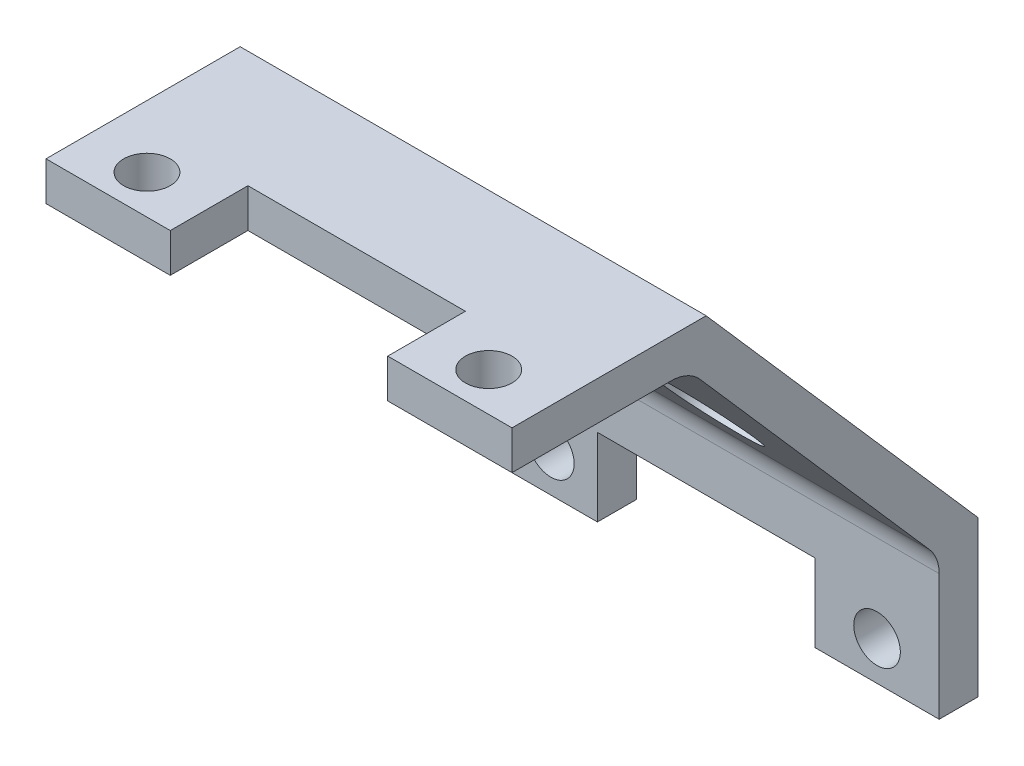
ISO-10303-21;
HEADER;
FILE_DESCRIPTION(('STEP AP214'),'2;1');
FILE_NAME('part.step','',(''),(''),'','','');
FILE_SCHEMA(('AUTOMOTIVE_DESIGN { 1 0 10303 214 1 1 1 1 }'));
ENDSEC;
DATA;
#1=APPLICATION_CONTEXT('core data for automotive mechanical design processes');
#2=APPLICATION_PROTOCOL_DEFINITION('international standard','automotive_design',2000,#1);
#3=PRODUCT_CONTEXT('',#1,'mechanical');
#4=PRODUCT('Part','Part','',(#3));
#5=PRODUCT_RELATED_PRODUCT_CATEGORY('part','',(#4));
#6=PRODUCT_DEFINITION_FORMATION('','',#4);
#7=PRODUCT_DEFINITION_CONTEXT('part definition',#1,'design');
#8=PRODUCT_DEFINITION('design','',#6,#7);
#9=PRODUCT_DEFINITION_SHAPE('','',#8);
#10=(LENGTH_UNIT() NAMED_UNIT(*) SI_UNIT(.MILLI.,.METRE.));
#11=(NAMED_UNIT(*) PLANE_ANGLE_UNIT() SI_UNIT($,.RADIAN.));
#12=(NAMED_UNIT(*) SI_UNIT($,.STERADIAN.) SOLID_ANGLE_UNIT());
#13=UNCERTAINTY_MEASURE_WITH_UNIT(LENGTH_MEASURE(1.E-05),#10,'distance_accuracy_value','');
#14=(GEOMETRIC_REPRESENTATION_CONTEXT(3) GLOBAL_UNCERTAINTY_ASSIGNED_CONTEXT((#13)) GLOBAL_UNIT_ASSIGNED_CONTEXT((#10,
#11,#12)) REPRESENTATION_CONTEXT('',''));
#15=CARTESIAN_POINT('',(0.,0.,0.));
#16=DIRECTION('',(0.,0.,1.));
#17=DIRECTION('',(1.,0.,0.));
#18=AXIS2_PLACEMENT_3D('',#15,#16,#17);
#19=CARTESIAN_POINT('',(60.,60.,55.));
#20=DIRECTION('',(0.,0.,-1.));
#21=DIRECTION('',(-1.,0.,0.));
#22=AXIS2_PLACEMENT_3D('',#19,#20,#21);
#23=PLANE('',#22);
#24=DIRECTION('',(-1.,0.,0.));
#25=VECTOR('',#24,1.);
#26=CARTESIAN_POINT('',(60.,55.,55.));
#27=LINE('',#26,#25);
#28=CARTESIAN_POINT('',(16.,55.,55.));
#29=VERTEX_POINT('',#28);
#30=CARTESIAN_POINT('',(0.,55.,55.));
#31=VERTEX_POINT('',#30);
#32=EDGE_CURVE('E335',#29,#31,#27,.T.);
#33=ORIENTED_EDGE('',*,*,#32,.F.);
#34=DIRECTION('',(0.,1.,0.));
#35=VECTOR('',#34,1.);
#36=CARTESIAN_POINT('',(16.,0.,55.));
#37=LINE('',#36,#35);
#38=CARTESIAN_POINT('',(16.,60.,55.));
#39=VERTEX_POINT('',#38);
#40=EDGE_CURVE('E195',#29,#39,#37,.T.);
#41=ORIENTED_EDGE('',*,*,#40,.T.);
#42=DIRECTION('',(-1.,0.,0.));
#43=VECTOR('',#42,1.);
#44=CARTESIAN_POINT('',(60.,60.,55.));
#45=LINE('',#44,#43);
#46=CARTESIAN_POINT('',(0.,60.,55.));
#47=VERTEX_POINT('',#46);
#48=EDGE_CURVE('E185',#39,#47,#45,.T.);
#49=ORIENTED_EDGE('',*,*,#48,.T.);
#50=DIRECTION('',(0.,-1.,0.));
#51=VECTOR('',#50,1.);
#52=CARTESIAN_POINT('',(0.,60.,55.));
#53=LINE('',#52,#51);
#54=EDGE_CURVE('E292',#47,#31,#53,.T.);
#55=ORIENTED_EDGE('',*,*,#54,.T.);
#56=EDGE_LOOP('',(#33,#41,#49,#55));
#57=FACE_BOUND('',#56,.T.);
#58=ADVANCED_FACE('F33',(#57),#23,.F.);
#59=CARTESIAN_POINT('',(60.,0.,0.));
#60=DIRECTION('',(0.,1.,0.));
#61=DIRECTION('',(0.,0.,1.));
#62=AXIS2_PLACEMENT_3D('',#59,#60,#61);
#63=PLANE('',#62);
#64=DIRECTION('',(-1.,0.,0.));
#65=VECTOR('',#64,1.);
#66=CARTESIAN_POINT('',(60.,0.,0.));
#67=LINE('',#66,#65);
#68=CARTESIAN_POINT('',(60.,0.,0.));
#69=VERTEX_POINT('',#68);
#70=CARTESIAN_POINT('',(44.,0.,0.));
#71=VERTEX_POINT('',#70);
#72=EDGE_CURVE('E322',#69,#71,#67,.T.);
#73=ORIENTED_EDGE('',*,*,#72,.T.);
#74=DIRECTION('',(0.,0.,-1.));
#75=VECTOR('',#74,1.);
#76=CARTESIAN_POINT('',(44.,0.,55.001));
#77=LINE('',#76,#75);
#78=CARTESIAN_POINT('',(44.,0.,-5.));
#79=VERTEX_POINT('',#78);
#80=EDGE_CURVE('E234',#71,#79,#77,.T.);
#81=ORIENTED_EDGE('',*,*,#80,.T.);
#82=DIRECTION('',(-1.,0.,0.));
#83=VECTOR('',#82,1.);
#84=CARTESIAN_POINT('',(60.,0.,-5.));
#85=LINE('',#84,#83);
#86=CARTESIAN_POINT('',(60.,0.,-5.));
#87=VERTEX_POINT('',#86);
#88=EDGE_CURVE('E318',#87,#79,#85,.T.);
#89=ORIENTED_EDGE('',*,*,#88,.F.);
#90=DIRECTION('',(0.,0.,-1.));
#91=VECTOR('',#90,1.);
#92=CARTESIAN_POINT('',(60.,0.,0.));
#93=LINE('',#92,#91);
#94=EDGE_CURVE('E283',#69,#87,#93,.T.);
#95=ORIENTED_EDGE('',*,*,#94,.F.);
#96=EDGE_LOOP('',(#73,#81,#89,#95));
#97=FACE_BOUND('',#96,.T.);
#98=ADVANCED_FACE('F370',(#97),#63,.F.);
#99=CARTESIAN_POINT('',(60.,60.,30.));
#100=DIRECTION('',(0.,-1.,0.));
#101=DIRECTION('',(0.,0.,-1.));
#102=AXIS2_PLACEMENT_3D('',#99,#100,#101);
#103=PLANE('',#102);
#104=CARTESIAN_POINT('',(52.,60.,50.));
#105=DIRECTION('',(0.,1.,0.));
#106=DIRECTION('',(0.,0.,1.));
#107=AXIS2_PLACEMENT_3D('',#104,#105,#106);
#108=CIRCLE('',#107,3.);
#109=CARTESIAN_POINT('',(52.,60.,53.));
#110=VERTEX_POINT('',#109);
#111=EDGE_CURVE('E360',#110,#110,#108,.T.);
#112=ORIENTED_EDGE('',*,*,#111,.F.);
#113=EDGE_LOOP('',(#112));
#114=FACE_BOUND('',#113,.T.);
#115=CARTESIAN_POINT('',(8.,60.,50.));
#116=DIRECTION('',(0.,1.,0.));
#117=DIRECTION('',(0.,0.,1.));
#118=AXIS2_PLACEMENT_3D('',#115,#116,#117);
#119=CIRCLE('',#118,3.);
#120=CARTESIAN_POINT('',(8.,60.,53.));
#121=VERTEX_POINT('',#120);
#122=EDGE_CURVE('E180',#121,#121,#119,.T.);
#123=ORIENTED_EDGE('',*,*,#122,.F.);
#124=EDGE_LOOP('',(#123));
#125=FACE_BOUND('',#124,.T.);
#126=ORIENTED_EDGE('',*,*,#48,.F.);
#127=DIRECTION('',(0.,0.,1.));
#128=VECTOR('',#127,1.);
#129=CARTESIAN_POINT('',(16.,60.,55.));
#130=LINE('',#129,#128);
#131=CARTESIAN_POINT('',(16.,60.,45.));
#132=VERTEX_POINT('',#131);
#133=EDGE_CURVE('E170',#132,#39,#130,.T.);
#134=ORIENTED_EDGE('',*,*,#133,.F.);
#135=DIRECTION('',(-1.,0.,0.));
#136=VECTOR('',#135,1.);
#137=CARTESIAN_POINT('',(16.,60.,45.));
#138=LINE('',#137,#136);
#139=CARTESIAN_POINT('',(44.,60.,45.));
#140=VERTEX_POINT('',#139);
#141=EDGE_CURVE('E179',#140,#132,#138,.T.);
#142=ORIENTED_EDGE('',*,*,#141,.F.);
#143=DIRECTION('',(0.,0.,-1.));
#144=VECTOR('',#143,1.);
#145=CARTESIAN_POINT('',(44.,60.,45.));
#146=LINE('',#145,#144);
#147=CARTESIAN_POINT('',(44.,60.,55.));
#148=VERTEX_POINT('',#147);
#149=EDGE_CURVE('E162',#148,#140,#146,.T.);
#150=ORIENTED_EDGE('',*,*,#149,.F.);
#151=CARTESIAN_POINT('',(60.,60.,55.));
#152=VERTEX_POINT('',#151);
#153=EDGE_CURVE('E176',#152,#148,#45,.T.);
#154=ORIENTED_EDGE('',*,*,#153,.F.);
#155=DIRECTION('',(0.,0.,1.));
#156=VECTOR('',#155,1.);
#157=CARTESIAN_POINT('',(60.,60.,30.));
#158=LINE('',#157,#156);
#159=CARTESIAN_POINT('',(60.,60.,30.));
#160=VERTEX_POINT('',#159);
#161=EDGE_CURVE('E269',#160,#152,#158,.T.);
#162=ORIENTED_EDGE('',*,*,#161,.F.);
#163=DIRECTION('',(-1.,0.,0.));
#164=VECTOR('',#163,1.);
#165=CARTESIAN_POINT('',(60.,60.,30.));
#166=LINE('',#165,#164);
#167=CARTESIAN_POINT('',(0.,60.,30.));
#168=VERTEX_POINT('',#167);
#169=EDGE_CURVE('E289',#160,#168,#166,.T.);
#170=ORIENTED_EDGE('',*,*,#169,.T.);
#171=DIRECTION('',(0.,0.,1.));
#172=VECTOR('',#171,1.);
#173=CARTESIAN_POINT('',(0.,60.,30.));
#174=LINE('',#173,#172);
#175=EDGE_CURVE('E268',#168,#47,#174,.T.);
#176=ORIENTED_EDGE('',*,*,#175,.T.);
#177=EDGE_LOOP('',(#126,#134,#142,#150,#154,#162,#170,#176));
#178=FACE_BOUND('',#177,.T.);
#179=ADVANCED_FACE('F35',(#114,#125,#178),#103,.F.);
#180=ORIENTED_EDGE('',*,*,#153,.T.);
#181=DIRECTION('',(0.,1.,0.));
#182=VECTOR('',#181,1.);
#183=CARTESIAN_POINT('',(44.,0.,55.));
#184=LINE('',#183,#182);
#185=CARTESIAN_POINT('',(44.,55.,55.));
#186=VERTEX_POINT('',#185);
#187=EDGE_CURVE('E159',#186,#148,#184,.T.);
#188=ORIENTED_EDGE('',*,*,#187,.F.);
#189=CARTESIAN_POINT('',(60.,55.,55.));
#190=VERTEX_POINT('',#189);
#191=EDGE_CURVE('E188',#190,#186,#27,.T.);
#192=ORIENTED_EDGE('',*,*,#191,.F.);
#193=DIRECTION('',(0.,-1.,0.));
#194=VECTOR('',#193,1.);
#195=CARTESIAN_POINT('',(60.,60.,55.));
#196=LINE('',#195,#194);
#197=EDGE_CURVE('E183',#152,#190,#196,.T.);
#198=ORIENTED_EDGE('',*,*,#197,.F.);
#199=EDGE_LOOP('',(#180,#188,#192,#198));
#200=FACE_BOUND('',#199,.T.);
#201=ADVANCED_FACE('F182',(#200),#23,.F.);
#202=CARTESIAN_POINT('',(60.,55.,55.));
#203=DIRECTION('',(0.,1.,0.));
#204=DIRECTION('',(0.,0.,1.));
#205=AXIS2_PLACEMENT_3D('',#202,#203,#204);
#206=PLANE('',#205);
#207=CARTESIAN_POINT('',(52.,55.,50.));
#208=DIRECTION('',(0.,1.,0.));
#209=DIRECTION('',(0.,0.,1.));
#210=AXIS2_PLACEMENT_3D('',#207,#208,#209);
#211=CIRCLE('',#210,3.);
#212=CARTESIAN_POINT('',(52.,55.,53.));
#213=VERTEX_POINT('',#212);
#214=EDGE_CURVE('E37',#213,#213,#211,.T.);
#215=ORIENTED_EDGE('',*,*,#214,.T.);
#216=EDGE_LOOP('',(#215));
#217=FACE_BOUND('',#216,.T.);
#218=CARTESIAN_POINT('',(8.,55.,50.));
#219=DIRECTION('',(0.,1.,0.));
#220=DIRECTION('',(0.,0.,1.));
#221=AXIS2_PLACEMENT_3D('',#218,#219,#220);
#222=CIRCLE('',#221,3.);
#223=CARTESIAN_POINT('',(8.,55.,53.));
#224=VERTEX_POINT('',#223);
#225=EDGE_CURVE('E193',#224,#224,#222,.T.);
#226=ORIENTED_EDGE('',*,*,#225,.T.);
#227=EDGE_LOOP('',(#226));
#228=FACE_BOUND('',#227,.T.);
#229=DIRECTION('',(-1.,0.,0.));
#230=VECTOR('',#229,1.);
#231=CARTESIAN_POINT('',(60.,55.,45.));
#232=LINE('',#231,#230);
#233=CARTESIAN_POINT('',(44.,55.,45.));
#234=VERTEX_POINT('',#233);
#235=CARTESIAN_POINT('',(16.,55.,45.));
#236=VERTEX_POINT('',#235);
#237=EDGE_CURVE('E42',#234,#236,#232,.T.);
#238=ORIENTED_EDGE('',*,*,#237,.T.);
#239=DIRECTION('',(0.,0.,1.));
#240=VECTOR('',#239,1.);
#241=CARTESIAN_POINT('',(16.,55.,55.));
#242=LINE('',#241,#240);
#243=EDGE_CURVE('E11',#236,#29,#242,.T.);
#244=ORIENTED_EDGE('',*,*,#243,.T.);
#245=ORIENTED_EDGE('',*,*,#32,.T.);
#246=DIRECTION('',(0.,0.,-1.));
#247=VECTOR('',#246,1.);
#248=CARTESIAN_POINT('',(0.,55.,55.));
#249=LINE('',#248,#247);
#250=CARTESIAN_POINT('',(0.,55.,34.5376822659183));
#251=VERTEX_POINT('',#250);
#252=EDGE_CURVE('E295',#31,#251,#249,.T.);
#253=ORIENTED_EDGE('',*,*,#252,.T.);
#254=DIRECTION('',(-1.,0.,0.));
#255=VECTOR('',#254,1.);
#256=CARTESIAN_POINT('',(60.,55.,34.5376822659183));
#257=LINE('',#256,#255);
#258=CARTESIAN_POINT('',(60.,55.,34.5376822659183));
#259=VERTEX_POINT('',#258);
#260=EDGE_CURVE('E333',#259,#251,#257,.T.);
#261=ORIENTED_EDGE('',*,*,#260,.F.);
#262=DIRECTION('',(0.,0.,-1.));
#263=VECTOR('',#262,1.);
#264=CARTESIAN_POINT('',(60.,55.,55.));
#265=LINE('',#264,#263);
#266=EDGE_CURVE('E273',#190,#259,#265,.T.);
#267=ORIENTED_EDGE('',*,*,#266,.F.);
#268=ORIENTED_EDGE('',*,*,#191,.T.);
#269=DIRECTION('',(0.,0.,-1.));
#270=VECTOR('',#269,1.);
#271=CARTESIAN_POINT('',(44.,55.,55.));
#272=LINE('',#271,#270);
#273=EDGE_CURVE('E165',#186,#234,#272,.T.);
#274=ORIENTED_EDGE('',*,*,#273,.T.);
#275=EDGE_LOOP('',(#238,#244,#245,#253,#261,#267,#268,#274));
#276=FACE_BOUND('',#275,.T.);
#277=ADVANCED_FACE('F342',(#217,#228,#276),#206,.F.);
#278=CARTESIAN_POINT('',(60.,50.,34.5376822659183));
#279=DIRECTION('',(-1.,0.,0.));
#280=DIRECTION('',(0.,0.,1.));
#281=AXIS2_PLACEMENT_3D('',#278,#279,#280);
#282=CYLINDRICAL_SURFACE('',#281,5.);
#283=CARTESIAN_POINT('',(0.,50.,34.5376822659183));
#284=DIRECTION('',(-1.,0.,0.));
#285=DIRECTION('',(0.,0.,-1.));
#286=AXIS2_PLACEMENT_3D('',#283,#284,#285);
#287=CIRCLE('',#286,5.);
#288=CARTESIAN_POINT('',(0.,53.2925230393426,30.7747987923839));
#289=VERTEX_POINT('',#288);
#290=EDGE_CURVE('E297',#251,#289,#287,.T.);
#291=ORIENTED_EDGE('',*,*,#290,.T.);
#292=DIRECTION('',(-1.,0.,0.));
#293=VECTOR('',#292,1.);
#294=CARTESIAN_POINT('',(60.,53.2925230393426,30.7747987923839));
#295=LINE('',#294,#293);
#296=CARTESIAN_POINT('',(60.,53.2925230393426,30.7747987923839));
#297=VERTEX_POINT('',#296);
#298=EDGE_CURVE('E331',#297,#289,#295,.T.);
#299=ORIENTED_EDGE('',*,*,#298,.F.);
#300=CARTESIAN_POINT('',(60.,50.,34.5376822659183));
#301=DIRECTION('',(-1.,0.,0.));
#302=DIRECTION('',(0.,0.,-1.));
#303=AXIS2_PLACEMENT_3D('',#300,#301,#302);
#304=CIRCLE('',#303,5.);
#305=EDGE_CURVE('E275',#259,#297,#304,.T.);
#306=ORIENTED_EDGE('',*,*,#305,.F.);
#307=ORIENTED_EDGE('',*,*,#260,.T.);
#308=EDGE_LOOP('',(#291,#299,#306,#307));
#309=FACE_BOUND('',#308,.T.);
#310=ADVANCED_FACE('F386',(#309),#282,.F.);
#311=CARTESIAN_POINT('',(60.,53.2925230393426,30.7747987923839));
#312=DIRECTION('',(0.,0.658504607868518,-0.752576694706878));
#313=DIRECTION('',(0.,0.752576694706878,0.658504607868518));
#314=AXIS2_PLACEMENT_3D('',#311,#312,#313);
#315=PLANE('',#314);
#316=CARTESIAN_POINT('',(40.,29.1819843517533,9.67807744074332));
#317=DIRECTION('',(0.,0.658504607868518,-0.752576694706878));
#318=DIRECTION('',(0.,0.752576694706878,0.658504607868518));
#319=AXIS2_PLACEMENT_3D('',#316,#317,#318);
#320=CIRCLE('',#319,6.00000000000001);
#321=CARTESIAN_POINT('',(40.,33.6974445199946,13.6291050879544));
#322=VERTEX_POINT('',#321);
#323=EDGE_CURVE('E254',#322,#322,#320,.F.);
#324=ORIENTED_EDGE('',*,*,#323,.F.);
#325=EDGE_LOOP('',(#324));
#326=FACE_BOUND('',#325,.T.);
#327=CARTESIAN_POINT('',(20.,44.2335182458909,22.8481695981137));
#328=DIRECTION('',(0.,0.658504607868518,-0.752576694706878));
#329=DIRECTION('',(0.,0.752576694706878,0.658504607868518));
#330=AXIS2_PLACEMENT_3D('',#327,#328,#329);
#331=CIRCLE('',#330,6.00000000000001);
#332=CARTESIAN_POINT('',(20.,48.7489784141322,26.7991972453248));
#333=VERTEX_POINT('',#332);
#334=EDGE_CURVE('E255',#333,#333,#331,.F.);
#335=ORIENTED_EDGE('',*,*,#334,.F.);
#336=EDGE_LOOP('',(#335));
#337=FACE_BOUND('',#336,.T.);
#338=CARTESIAN_POINT('',(20.,29.1819843517533,9.67807744074332));
#339=DIRECTION('',(0.,0.658504607868518,-0.752576694706878));
#340=DIRECTION('',(0.,0.752576694706878,0.658504607868518));
#341=AXIS2_PLACEMENT_3D('',#338,#339,#340);
#342=CIRCLE('',#341,6.);
#343=CARTESIAN_POINT('',(20.,33.6974445199946,13.6291050879544));
#344=VERTEX_POINT('',#343);
#345=EDGE_CURVE('E247',#344,#344,#342,.F.);
#346=ORIENTED_EDGE('',*,*,#345,.F.);
#347=EDGE_LOOP('',(#346));
#348=FACE_BOUND('',#347,.T.);
#349=CARTESIAN_POINT('',(40.,44.2335182458909,22.8481695981137));
#350=DIRECTION('',(0.,0.658504607868518,-0.752576694706878));
#351=DIRECTION('',(0.,0.752576694706878,0.658504607868518));
#352=AXIS2_PLACEMENT_3D('',#349,#350,#351);
#353=CIRCLE('',#352,6.00000000000001);
#354=CARTESIAN_POINT('',(40.,48.7489784141322,26.7991972453248));
#355=VERTEX_POINT('',#354);
#356=EDGE_CURVE('E265',#355,#355,#353,.F.);
#357=ORIENTED_EDGE('',*,*,#356,.F.);
#358=EDGE_LOOP('',(#357));
#359=FACE_BOUND('',#358,.T.);
#360=DIRECTION('',(0.,-0.752576694706878,-0.658504607868518));
#361=VECTOR('',#360,1.);
#362=CARTESIAN_POINT('',(0.,53.2925230393426,30.7747987923839));
#363=LINE('',#362,#361);
#364=CARTESIAN_POINT('',(0.,19.5351718782931,1.23711652646561));
#365=VERTEX_POINT('',#364);
#366=EDGE_CURVE('E299',#289,#365,#363,.T.);
#367=ORIENTED_EDGE('',*,*,#366,.T.);
#368=DIRECTION('',(-1.,0.,0.));
#369=VECTOR('',#368,1.);
#370=CARTESIAN_POINT('',(60.,19.5351718782931,1.23711652646561));
#371=LINE('',#370,#369);
#372=CARTESIAN_POINT('',(60.,19.5351718782931,1.23711652646561));
#373=VERTEX_POINT('',#372);
#374=EDGE_CURVE('E328',#373,#365,#371,.T.);
#375=ORIENTED_EDGE('',*,*,#374,.F.);
#376=DIRECTION('',(0.,-0.752576694706878,-0.658504607868518));
#377=VECTOR('',#376,1.);
#378=CARTESIAN_POINT('',(60.,53.2925230393426,30.7747987923839));
#379=LINE('',#378,#377);
#380=EDGE_CURVE('E277',#297,#373,#379,.T.);
#381=ORIENTED_EDGE('',*,*,#380,.F.);
#382=ORIENTED_EDGE('',*,*,#298,.T.);
#383=EDGE_LOOP('',(#367,#375,#381,#382));
#384=FACE_BOUND('',#383,.T.);
#385=ADVANCED_FACE('F390',(#326,#337,#348,#359,#384),#315,.F.);
#386=CARTESIAN_POINT('',(60.,16.2426488389505,5.));
#387=DIRECTION('',(-1.,0.,0.));
#388=DIRECTION('',(0.,0.,1.));
#389=AXIS2_PLACEMENT_3D('',#386,#387,#388);
#390=CYLINDRICAL_SURFACE('',#389,5.);
#391=CARTESIAN_POINT('',(0.,16.2426488389505,5.));
#392=DIRECTION('',(-1.,0.,0.));
#393=DIRECTION('',(0.,0.,-1.));
#394=AXIS2_PLACEMENT_3D('',#391,#392,#393);
#395=CIRCLE('',#394,5.);
#396=CARTESIAN_POINT('',(0.,16.2426488389505,0.));
#397=VERTEX_POINT('',#396);
#398=EDGE_CURVE('E301',#365,#397,#395,.T.);
#399=ORIENTED_EDGE('',*,*,#398,.T.);
#400=DIRECTION('',(-1.,0.,0.));
#401=VECTOR('',#400,1.);
#402=CARTESIAN_POINT('',(60.,16.2426488389505,0.));
#403=LINE('',#402,#401);
#404=CARTESIAN_POINT('',(60.,16.2426488389505,0.));
#405=VERTEX_POINT('',#404);
#406=EDGE_CURVE('E325',#405,#397,#403,.T.);
#407=ORIENTED_EDGE('',*,*,#406,.F.);
#408=CARTESIAN_POINT('',(60.,16.2426488389505,5.));
#409=DIRECTION('',(-1.,0.,0.));
#410=DIRECTION('',(0.,0.,-1.));
#411=AXIS2_PLACEMENT_3D('',#408,#409,#410);
#412=CIRCLE('',#411,5.);
#413=EDGE_CURVE('E279',#373,#405,#412,.T.);
#414=ORIENTED_EDGE('',*,*,#413,.F.);
#415=ORIENTED_EDGE('',*,*,#374,.T.);
#416=EDGE_LOOP('',(#399,#407,#414,#415));
#417=FACE_BOUND('',#416,.T.);
#418=ADVANCED_FACE('F393',(#417),#390,.F.);
#419=CARTESIAN_POINT('',(60.,16.2426488389505,0.));
#420=DIRECTION('',(0.,0.,-1.));
#421=DIRECTION('',(-1.,0.,0.));
#422=AXIS2_PLACEMENT_3D('',#419,#420,#421);
#423=PLANE('',#422);
#424=CARTESIAN_POINT('',(10.,5.,0.));
#425=DIRECTION('',(0.,0.,-1.));
#426=DIRECTION('',(-1.,0.,0.));
#427=AXIS2_PLACEMENT_3D('',#424,#425,#426);
#428=CIRCLE('',#427,3.);
#429=CARTESIAN_POINT('',(7.,5.,0.));
#430=VERTEX_POINT('',#429);
#431=EDGE_CURVE('E214',#430,#430,#428,.F.);
#432=ORIENTED_EDGE('',*,*,#431,.F.);
#433=EDGE_LOOP('',(#432));
#434=FACE_BOUND('',#433,.T.);
#435=CARTESIAN_POINT('',(52.,5.,0.));
#436=DIRECTION('',(0.,0.,-1.));
#437=DIRECTION('',(-1.,0.,0.));
#438=AXIS2_PLACEMENT_3D('',#435,#436,#437);
#439=CIRCLE('',#438,3.);
#440=CARTESIAN_POINT('',(49.,5.,0.));
#441=VERTEX_POINT('',#440);
#442=EDGE_CURVE('E213',#441,#441,#439,.F.);
#443=ORIENTED_EDGE('',*,*,#442,.F.);
#444=EDGE_LOOP('',(#443));
#445=FACE_BOUND('',#444,.T.);
#446=DIRECTION('',(-1.,0.,0.));
#447=VECTOR('',#446,1.);
#448=CARTESIAN_POINT('',(44.,10.,0.));
#449=LINE('',#448,#447);
#450=CARTESIAN_POINT('',(44.,10.,0.));
#451=VERTEX_POINT('',#450);
#452=CARTESIAN_POINT('',(16.,10.,0.));
#453=VERTEX_POINT('',#452);
#454=EDGE_CURVE('E217',#451,#453,#449,.T.);
#455=ORIENTED_EDGE('',*,*,#454,.F.);
#456=DIRECTION('',(0.,1.,0.));
#457=VECTOR('',#456,1.);
#458=CARTESIAN_POINT('',(44.,0.,0.));
#459=LINE('',#458,#457);
#460=EDGE_CURVE('E224',#71,#451,#459,.T.);
#461=ORIENTED_EDGE('',*,*,#460,.F.);
#462=ORIENTED_EDGE('',*,*,#72,.F.);
#463=DIRECTION('',(0.,-1.,0.));
#464=VECTOR('',#463,1.);
#465=CARTESIAN_POINT('',(60.,16.2426488389505,0.));
#466=LINE('',#465,#464);
#467=EDGE_CURVE('E281',#405,#69,#466,.T.);
#468=ORIENTED_EDGE('',*,*,#467,.F.);
#469=ORIENTED_EDGE('',*,*,#406,.T.);
#470=DIRECTION('',(0.,-1.,0.));
#471=VECTOR('',#470,1.);
#472=CARTESIAN_POINT('',(0.,16.2426488389505,0.));
#473=LINE('',#472,#471);
#474=CARTESIAN_POINT('',(0.,0.,0.));
#475=VERTEX_POINT('',#474);
#476=EDGE_CURVE('E303',#397,#475,#473,.T.);
#477=ORIENTED_EDGE('',*,*,#476,.T.);
#478=CARTESIAN_POINT('',(16.,0.,0.));
#479=VERTEX_POINT('',#478);
#480=EDGE_CURVE('E321',#479,#475,#67,.T.);
#481=ORIENTED_EDGE('',*,*,#480,.F.);
#482=DIRECTION('',(0.,-1.,0.));
#483=VECTOR('',#482,1.);
#484=CARTESIAN_POINT('',(16.,10.,0.));
#485=LINE('',#484,#483);
#486=EDGE_CURVE('E237',#453,#479,#485,.T.);
#487=ORIENTED_EDGE('',*,*,#486,.F.);
#488=EDGE_LOOP('',(#455,#461,#462,#468,#469,#477,#481,#487));
#489=FACE_BOUND('',#488,.T.);
#490=ADVANCED_FACE('F397',(#434,#445,#489),#423,.F.);
#491=CARTESIAN_POINT('',(16.,0.,-5.));
#492=VERTEX_POINT('',#491);
#493=CARTESIAN_POINT('',(0.,0.,-5.));
#494=VERTEX_POINT('',#493);
#495=EDGE_CURVE('E317',#492,#494,#85,.T.);
#496=ORIENTED_EDGE('',*,*,#495,.F.);
#497=DIRECTION('',(0.,0.,-1.));
#498=VECTOR('',#497,1.);
#499=CARTESIAN_POINT('',(16.,0.,55.001));
#500=LINE('',#499,#498);
#501=EDGE_CURVE('E58',#479,#492,#500,.T.);
#502=ORIENTED_EDGE('',*,*,#501,.F.);
#503=ORIENTED_EDGE('',*,*,#480,.T.);
#504=DIRECTION('',(0.,0.,-1.));
#505=VECTOR('',#504,1.);
#506=CARTESIAN_POINT('',(0.,0.,0.));
#507=LINE('',#506,#505);
#508=EDGE_CURVE('E306',#475,#494,#507,.T.);
#509=ORIENTED_EDGE('',*,*,#508,.T.);
#510=EDGE_LOOP('',(#496,#502,#503,#509));
#511=FACE_BOUND('',#510,.T.);
#512=ADVANCED_FACE('F378',(#511),#63,.F.);
#513=CARTESIAN_POINT('',(60.,0.,-5.));
#514=DIRECTION('',(0.,0.,1.));
#515=DIRECTION('',(1.,0.,0.));
#516=AXIS2_PLACEMENT_3D('',#513,#514,#515);
#517=PLANE('',#516);
#518=CARTESIAN_POINT('',(10.,5.,-5.));
#519=DIRECTION('',(0.,0.,-1.));
#520=DIRECTION('',(-1.,0.,0.));
#521=AXIS2_PLACEMENT_3D('',#518,#519,#520);
#522=CIRCLE('',#521,3.);
#523=CARTESIAN_POINT('',(7.,5.,-5.));
#524=VERTEX_POINT('',#523);
#525=EDGE_CURVE('E199',#524,#524,#522,.T.);
#526=ORIENTED_EDGE('',*,*,#525,.F.);
#527=EDGE_LOOP('',(#526));
#528=FACE_BOUND('',#527,.T.);
#529=CARTESIAN_POINT('',(52.,5.,-5.));
#530=DIRECTION('',(0.,0.,-1.));
#531=DIRECTION('',(-1.,0.,0.));
#532=AXIS2_PLACEMENT_3D('',#529,#530,#531);
#533=CIRCLE('',#532,3.);
#534=CARTESIAN_POINT('',(49.,5.,-5.));
#535=VERTEX_POINT('',#534);
#536=EDGE_CURVE('E210',#535,#535,#533,.T.);
#537=ORIENTED_EDGE('',*,*,#536,.F.);
#538=EDGE_LOOP('',(#537));
#539=FACE_BOUND('',#538,.T.);
#540=ORIENTED_EDGE('',*,*,#88,.T.);
#541=DIRECTION('',(0.,-1.,0.));
#542=VECTOR('',#541,1.);
#543=CARTESIAN_POINT('',(44.,0.,-5.));
#544=LINE('',#543,#542);
#545=CARTESIAN_POINT('',(44.,10.,-5.));
#546=VERTEX_POINT('',#545);
#547=EDGE_CURVE('E232',#546,#79,#544,.T.);
#548=ORIENTED_EDGE('',*,*,#547,.F.);
#549=DIRECTION('',(1.,0.,0.));
#550=VECTOR('',#549,1.);
#551=CARTESIAN_POINT('',(44.,10.,-5.));
#552=LINE('',#551,#550);
#553=CARTESIAN_POINT('',(16.,10.,-5.));
#554=VERTEX_POINT('',#553);
#555=EDGE_CURVE('E229',#554,#546,#552,.T.);
#556=ORIENTED_EDGE('',*,*,#555,.F.);
#557=DIRECTION('',(0.,1.,0.));
#558=VECTOR('',#557,1.);
#559=CARTESIAN_POINT('',(16.,10.,-5.));
#560=LINE('',#559,#558);
#561=EDGE_CURVE('E227',#492,#554,#560,.T.);
#562=ORIENTED_EDGE('',*,*,#561,.F.);
#563=ORIENTED_EDGE('',*,*,#495,.T.);
#564=DIRECTION('',(0.,1.,0.));
#565=VECTOR('',#564,1.);
#566=CARTESIAN_POINT('',(0.,0.,-5.));
#567=LINE('',#566,#565);
#568=CARTESIAN_POINT('',(0.,20.,-5.));
#569=VERTEX_POINT('',#568);
#570=EDGE_CURVE('E309',#494,#569,#567,.T.);
#571=ORIENTED_EDGE('',*,*,#570,.T.);
#572=DIRECTION('',(-1.,0.,0.));
#573=VECTOR('',#572,1.);
#574=CARTESIAN_POINT('',(60.,20.,-5.));
#575=LINE('',#574,#573);
#576=CARTESIAN_POINT('',(60.,20.,-5.));
#577=VERTEX_POINT('',#576);
#578=EDGE_CURVE('E314',#577,#569,#575,.T.);
#579=ORIENTED_EDGE('',*,*,#578,.F.);
#580=DIRECTION('',(0.,1.,0.));
#581=VECTOR('',#580,1.);
#582=CARTESIAN_POINT('',(60.,0.,-5.));
#583=LINE('',#582,#581);
#584=EDGE_CURVE('E285',#87,#577,#583,.T.);
#585=ORIENTED_EDGE('',*,*,#584,.F.);
#586=EDGE_LOOP('',(#540,#548,#556,#562,#563,#571,#579,#585));
#587=FACE_BOUND('',#586,.T.);
#588=ADVANCED_FACE('F403',(#528,#539,#587),#517,.F.);
#589=CARTESIAN_POINT('',(60.,20.,-5.));
#590=DIRECTION('',(0.,-0.658504607868518,0.752576694706878));
#591=DIRECTION('',(0.,-0.752576694706878,-0.658504607868518));
#592=AXIS2_PLACEMENT_3D('',#589,#590,#591);
#593=PLANE('',#592);
#594=CARTESIAN_POINT('',(40.,32.4745073910959,5.91519396720894));
#595=DIRECTION('',(0.,0.658504607868518,-0.752576694706878));
#596=DIRECTION('',(0.,0.752576694706878,0.658504607868518));
#597=AXIS2_PLACEMENT_3D('',#594,#595,#596);
#598=CIRCLE('',#597,6.00000000000001);
#599=CARTESIAN_POINT('',(40.,36.9899675593372,9.86622161442005));
#600=VERTEX_POINT('',#599);
#601=EDGE_CURVE('E251',#600,#600,#598,.T.);
#602=ORIENTED_EDGE('',*,*,#601,.F.);
#603=EDGE_LOOP('',(#602));
#604=FACE_BOUND('',#603,.T.);
#605=CARTESIAN_POINT('',(20.,47.5260412852335,19.0852861245793));
#606=DIRECTION('',(0.,0.658504607868518,-0.752576694706878));
#607=DIRECTION('',(0.,0.752576694706878,0.658504607868518));
#608=AXIS2_PLACEMENT_3D('',#605,#606,#607);
#609=CIRCLE('',#608,6.00000000000001);
#610=CARTESIAN_POINT('',(20.,52.0415014534748,23.0363137717904));
#611=VERTEX_POINT('',#610);
#612=EDGE_CURVE('E250',#611,#611,#609,.T.);
#613=ORIENTED_EDGE('',*,*,#612,.F.);
#614=EDGE_LOOP('',(#613));
#615=FACE_BOUND('',#614,.T.);
#616=CARTESIAN_POINT('',(20.,32.4745073910959,5.91519396720894));
#617=DIRECTION('',(0.,0.658504607868518,-0.752576694706878));
#618=DIRECTION('',(0.,0.752576694706878,0.658504607868518));
#619=AXIS2_PLACEMENT_3D('',#616,#617,#618);
#620=CIRCLE('',#619,6.);
#621=CARTESIAN_POINT('',(20.,36.9899675593372,9.86622161442005));
#622=VERTEX_POINT('',#621);
#623=EDGE_CURVE('E244',#622,#622,#620,.T.);
#624=ORIENTED_EDGE('',*,*,#623,.F.);
#625=EDGE_LOOP('',(#624));
#626=FACE_BOUND('',#625,.T.);
#627=CARTESIAN_POINT('',(40.,47.5260412852335,19.0852861245793));
#628=DIRECTION('',(0.,0.658504607868518,-0.752576694706878));
#629=DIRECTION('',(0.,0.752576694706878,0.658504607868518));
#630=AXIS2_PLACEMENT_3D('',#627,#628,#629);
#631=CIRCLE('',#630,6.00000000000001);
#632=CARTESIAN_POINT('',(40.,52.0415014534748,23.0363137717904));
#633=VERTEX_POINT('',#632);
#634=EDGE_CURVE('E258',#633,#633,#631,.T.);
#635=ORIENTED_EDGE('',*,*,#634,.F.);
#636=EDGE_LOOP('',(#635));
#637=FACE_BOUND('',#636,.T.);
#638=DIRECTION('',(0.,0.752576694706878,0.658504607868518));
#639=VECTOR('',#638,1.);
#640=CARTESIAN_POINT('',(0.,20.,-5.));
#641=LINE('',#640,#639);
#642=EDGE_CURVE('E271',#569,#168,#641,.T.);
#643=ORIENTED_EDGE('',*,*,#642,.T.);
#644=ORIENTED_EDGE('',*,*,#169,.F.);
#645=DIRECTION('',(0.,0.752576694706878,0.658504607868518));
#646=VECTOR('',#645,1.);
#647=CARTESIAN_POINT('',(60.,20.,-5.));
#648=LINE('',#647,#646);
#649=EDGE_CURVE('E287',#577,#160,#648,.T.);
#650=ORIENTED_EDGE('',*,*,#649,.F.);
#651=ORIENTED_EDGE('',*,*,#578,.T.);
#652=EDGE_LOOP('',(#643,#644,#650,#651));
#653=FACE_BOUND('',#652,.T.);
#654=ADVANCED_FACE('F407',(#604,#615,#626,#637,#653),#593,.F.);
#655=CARTESIAN_POINT('',(60.,50.,34.5376822659183));
#656=DIRECTION('',(1.,0.,0.));
#657=DIRECTION('',(0.,0.,-1.));
#658=AXIS2_PLACEMENT_3D('',#655,#656,#657);
#659=PLANE('',#658);
#660=ORIENTED_EDGE('',*,*,#161,.T.);
#661=ORIENTED_EDGE('',*,*,#197,.T.);
#662=ORIENTED_EDGE('',*,*,#266,.T.);
#663=ORIENTED_EDGE('',*,*,#305,.T.);
#664=ORIENTED_EDGE('',*,*,#380,.T.);
#665=ORIENTED_EDGE('',*,*,#413,.T.);
#666=ORIENTED_EDGE('',*,*,#467,.T.);
#667=ORIENTED_EDGE('',*,*,#94,.T.);
#668=ORIENTED_EDGE('',*,*,#584,.T.);
#669=ORIENTED_EDGE('',*,*,#649,.T.);
#670=EDGE_LOOP('',(#660,#661,#662,#663,#664,#665,#666,#667,#668,#669));
#671=FACE_BOUND('',#670,.T.);
#672=ADVANCED_FACE('F344',(#671),#659,.T.);
#673=CARTESIAN_POINT('',(0.,50.,34.5376822659183));
#674=DIRECTION('',(1.,0.,0.));
#675=DIRECTION('',(0.,0.,-1.));
#676=AXIS2_PLACEMENT_3D('',#673,#674,#675);
#677=PLANE('',#676);
#678=ORIENTED_EDGE('',*,*,#175,.F.);
#679=ORIENTED_EDGE('',*,*,#642,.F.);
#680=ORIENTED_EDGE('',*,*,#570,.F.);
#681=ORIENTED_EDGE('',*,*,#508,.F.);
#682=ORIENTED_EDGE('',*,*,#476,.F.);
#683=ORIENTED_EDGE('',*,*,#398,.F.);
#684=ORIENTED_EDGE('',*,*,#366,.F.);
#685=ORIENTED_EDGE('',*,*,#290,.F.);
#686=ORIENTED_EDGE('',*,*,#252,.F.);
#687=ORIENTED_EDGE('',*,*,#54,.F.);
#688=EDGE_LOOP('',(#678,#679,#680,#681,#682,#683,#684,#685,#686,#687));
#689=FACE_BOUND('',#688,.T.);
#690=ADVANCED_FACE('F353',(#689),#677,.F.);
#691=CARTESIAN_POINT('',(40.,9.118032435676,62.9801533812165));
#692=DIRECTION('',(0.,0.658504607868518,-0.752576694706878));
#693=DIRECTION('',(0.,0.752576694706878,0.658504607868518));
#694=AXIS2_PLACEMENT_3D('',#691,#692,#693);
#695=CYLINDRICAL_SURFACE('',#694,6.00000000000001);
#696=ORIENTED_EDGE('',*,*,#634,.T.);
#697=EDGE_LOOP('',(#696));
#698=FACE_BOUND('',#697,.T.);
#699=ORIENTED_EDGE('',*,*,#356,.T.);
#700=EDGE_LOOP('',(#699));
#701=FACE_BOUND('',#700,.T.);
#702=ADVANCED_FACE('F414',(#698,#701),#695,.F.);
#703=CARTESIAN_POINT('',(20.,-5.93350145846157,49.8100612238461));
#704=DIRECTION('',(0.,0.658504607868518,-0.752576694706878));
#705=DIRECTION('',(0.,0.752576694706878,0.658504607868518));
#706=AXIS2_PLACEMENT_3D('',#703,#704,#705);
#707=CYLINDRICAL_SURFACE('',#706,6.);
#708=ORIENTED_EDGE('',*,*,#623,.T.);
#709=EDGE_LOOP('',(#708));
#710=FACE_BOUND('',#709,.T.);
#711=ORIENTED_EDGE('',*,*,#345,.T.);
#712=EDGE_LOOP('',(#711));
#713=FACE_BOUND('',#712,.T.);
#714=ADVANCED_FACE('F419',(#710,#713),#707,.F.);
#715=CARTESIAN_POINT('',(20.,9.118032435676,62.9801533812165));
#716=DIRECTION('',(0.,0.658504607868518,-0.752576694706878));
#717=DIRECTION('',(0.,0.752576694706878,0.658504607868518));
#718=AXIS2_PLACEMENT_3D('',#715,#716,#717);
#719=CYLINDRICAL_SURFACE('',#718,6.00000000000001);
#720=ORIENTED_EDGE('',*,*,#612,.T.);
#721=EDGE_LOOP('',(#720));
#722=FACE_BOUND('',#721,.T.);
#723=ORIENTED_EDGE('',*,*,#334,.T.);
#724=EDGE_LOOP('',(#723));
#725=FACE_BOUND('',#724,.T.);
#726=ADVANCED_FACE('F421',(#722,#725),#719,.F.);
#727=CARTESIAN_POINT('',(40.,-5.93350145846157,49.8100612238461));
#728=DIRECTION('',(0.,0.658504607868518,-0.752576694706878));
#729=DIRECTION('',(0.,0.752576694706878,0.658504607868518));
#730=AXIS2_PLACEMENT_3D('',#727,#728,#729);
#731=CYLINDRICAL_SURFACE('',#730,6.00000000000001);
#732=ORIENTED_EDGE('',*,*,#601,.T.);
#733=EDGE_LOOP('',(#732));
#734=FACE_BOUND('',#733,.T.);
#735=ORIENTED_EDGE('',*,*,#323,.T.);
#736=EDGE_LOOP('',(#735));
#737=FACE_BOUND('',#736,.T.);
#738=ADVANCED_FACE('F424',(#734,#737),#731,.F.);
#739=CARTESIAN_POINT('',(44.,0.,55.001));
#740=DIRECTION('',(1.,0.,0.));
#741=DIRECTION('',(0.,0.,-1.));
#742=AXIS2_PLACEMENT_3D('',#739,#740,#741);
#743=PLANE('',#742);
#744=ORIENTED_EDGE('',*,*,#460,.T.);
#745=DIRECTION('',(0.,0.,-1.));
#746=VECTOR('',#745,1.);
#747=CARTESIAN_POINT('',(44.,10.,55.001));
#748=LINE('',#747,#746);
#749=EDGE_CURVE('E238',#451,#546,#748,.T.);
#750=ORIENTED_EDGE('',*,*,#749,.T.);
#751=ORIENTED_EDGE('',*,*,#547,.T.);
#752=ORIENTED_EDGE('',*,*,#80,.F.);
#753=EDGE_LOOP('',(#744,#750,#751,#752));
#754=FACE_BOUND('',#753,.T.);
#755=ADVANCED_FACE('F428',(#754),#743,.F.);
#756=CARTESIAN_POINT('',(44.,10.,55.001));
#757=DIRECTION('',(0.,1.,0.));
#758=DIRECTION('',(0.,0.,1.));
#759=AXIS2_PLACEMENT_3D('',#756,#757,#758);
#760=PLANE('',#759);
#761=ORIENTED_EDGE('',*,*,#454,.T.);
#762=DIRECTION('',(0.,0.,-1.));
#763=VECTOR('',#762,1.);
#764=CARTESIAN_POINT('',(16.,10.,55.001));
#765=LINE('',#764,#763);
#766=EDGE_CURVE('E240',#453,#554,#765,.T.);
#767=ORIENTED_EDGE('',*,*,#766,.T.);
#768=ORIENTED_EDGE('',*,*,#555,.T.);
#769=ORIENTED_EDGE('',*,*,#749,.F.);
#770=EDGE_LOOP('',(#761,#767,#768,#769));
#771=FACE_BOUND('',#770,.T.);
#772=ADVANCED_FACE('F437',(#771),#760,.F.);
#773=CARTESIAN_POINT('',(16.,10.,55.001));
#774=DIRECTION('',(-1.,0.,0.));
#775=DIRECTION('',(0.,0.,1.));
#776=AXIS2_PLACEMENT_3D('',#773,#774,#775);
#777=PLANE('',#776);
#778=ORIENTED_EDGE('',*,*,#486,.T.);
#779=ORIENTED_EDGE('',*,*,#501,.T.);
#780=ORIENTED_EDGE('',*,*,#561,.T.);
#781=ORIENTED_EDGE('',*,*,#766,.F.);
#782=EDGE_LOOP('',(#778,#779,#780,#781));
#783=FACE_BOUND('',#782,.T.);
#784=ADVANCED_FACE('F433',(#783),#777,.F.);
#785=CARTESIAN_POINT('',(52.,5.,55.001));
#786=DIRECTION('',(0.,0.,-1.));
#787=DIRECTION('',(-1.,0.,0.));
#788=AXIS2_PLACEMENT_3D('',#785,#786,#787);
#789=CYLINDRICAL_SURFACE('',#788,3.);
#790=ORIENTED_EDGE('',*,*,#536,.T.);
#791=EDGE_LOOP('',(#790));
#792=FACE_BOUND('',#791,.T.);
#793=ORIENTED_EDGE('',*,*,#442,.T.);
#794=EDGE_LOOP('',(#793));
#795=FACE_BOUND('',#794,.T.);
#796=ADVANCED_FACE('F436',(#792,#795),#789,.F.);
#797=CARTESIAN_POINT('',(10.,5.,55.001));
#798=DIRECTION('',(0.,0.,-1.));
#799=DIRECTION('',(-1.,0.,0.));
#800=AXIS2_PLACEMENT_3D('',#797,#798,#799);
#801=CYLINDRICAL_SURFACE('',#800,3.);
#802=ORIENTED_EDGE('',*,*,#525,.T.);
#803=EDGE_LOOP('',(#802));
#804=FACE_BOUND('',#803,.T.);
#805=ORIENTED_EDGE('',*,*,#431,.T.);
#806=EDGE_LOOP('',(#805));
#807=FACE_BOUND('',#806,.T.);
#808=ADVANCED_FACE('F444',(#804,#807),#801,.F.);
#809=CARTESIAN_POINT('',(16.,0.,55.));
#810=DIRECTION('',(-1.,0.,0.));
#811=DIRECTION('',(0.,0.,1.));
#812=AXIS2_PLACEMENT_3D('',#809,#810,#811);
#813=PLANE('',#812);
#814=DIRECTION('',(0.,1.,0.));
#815=VECTOR('',#814,1.);
#816=CARTESIAN_POINT('',(16.,0.,45.));
#817=LINE('',#816,#815);
#818=EDGE_CURVE('E201',#236,#132,#817,.T.);
#819=ORIENTED_EDGE('',*,*,#818,.T.);
#820=ORIENTED_EDGE('',*,*,#133,.T.);
#821=ORIENTED_EDGE('',*,*,#40,.F.);
#822=ORIENTED_EDGE('',*,*,#243,.F.);
#823=EDGE_LOOP('',(#819,#820,#821,#822));
#824=FACE_BOUND('',#823,.T.);
#825=ADVANCED_FACE('F447',(#824),#813,.F.);
#826=CARTESIAN_POINT('',(16.,0.,45.));
#827=DIRECTION('',(0.,0.,-1.));
#828=DIRECTION('',(0.,1.,0.));
#829=AXIS2_PLACEMENT_3D('',#826,#827,#828);
#830=PLANE('',#829);
#831=DIRECTION('',(0.,1.,0.));
#832=VECTOR('',#831,1.);
#833=CARTESIAN_POINT('',(44.,0.,45.));
#834=LINE('',#833,#832);
#835=EDGE_CURVE('E50',#234,#140,#834,.T.);
#836=ORIENTED_EDGE('',*,*,#835,.T.);
#837=ORIENTED_EDGE('',*,*,#141,.T.);
#838=ORIENTED_EDGE('',*,*,#818,.F.);
#839=ORIENTED_EDGE('',*,*,#237,.F.);
#840=EDGE_LOOP('',(#836,#837,#838,#839));
#841=FACE_BOUND('',#840,.T.);
#842=ADVANCED_FACE('F454',(#841),#830,.F.);
#843=CARTESIAN_POINT('',(44.,0.,45.));
#844=DIRECTION('',(1.,0.,0.));
#845=DIRECTION('',(0.,0.,-1.));
#846=AXIS2_PLACEMENT_3D('',#843,#844,#845);
#847=PLANE('',#846);
#848=ORIENTED_EDGE('',*,*,#187,.T.);
#849=ORIENTED_EDGE('',*,*,#149,.T.);
#850=ORIENTED_EDGE('',*,*,#835,.F.);
#851=ORIENTED_EDGE('',*,*,#273,.F.);
#852=EDGE_LOOP('',(#848,#849,#850,#851));
#853=FACE_BOUND('',#852,.T.);
#854=ADVANCED_FACE('F161',(#853),#847,.F.);
#855=CARTESIAN_POINT('',(8.,0.,50.));
#856=DIRECTION('',(0.,1.,0.));
#857=DIRECTION('',(0.,0.,1.));
#858=AXIS2_PLACEMENT_3D('',#855,#856,#857);
#859=CYLINDRICAL_SURFACE('',#858,3.);
#860=ORIENTED_EDGE('',*,*,#122,.T.);
#861=EDGE_LOOP('',(#860));
#862=FACE_BOUND('',#861,.T.);
#863=ORIENTED_EDGE('',*,*,#225,.F.);
#864=EDGE_LOOP('',(#863));
#865=FACE_BOUND('',#864,.T.);
#866=ADVANCED_FACE('F366',(#862,#865),#859,.F.);
#867=CARTESIAN_POINT('',(52.,0.,50.));
#868=DIRECTION('',(0.,1.,0.));
#869=DIRECTION('',(0.,0.,1.));
#870=AXIS2_PLACEMENT_3D('',#867,#868,#869);
#871=CYLINDRICAL_SURFACE('',#870,3.);
#872=ORIENTED_EDGE('',*,*,#111,.T.);
#873=EDGE_LOOP('',(#872));
#874=FACE_BOUND('',#873,.T.);
#875=ORIENTED_EDGE('',*,*,#214,.F.);
#876=EDGE_LOOP('',(#875));
#877=FACE_BOUND('',#876,.T.);
#878=ADVANCED_FACE('F459',(#874,#877),#871,.F.);
#879=CLOSED_SHELL('',(#58,#98,#179,#201,#277,#310,#385,#418,#490,#512,#588,#654,#672,#690,#702,
#714,#726,#738,#755,#772,#784,#796,#808,#825,#842,#854,#866,#878));
#880=MANIFOLD_SOLID_BREP('B2',#879);
#881=ADVANCED_BREP_SHAPE_REPRESENTATION('',(#18,#880),#14);
#882=SHAPE_DEFINITION_REPRESENTATION(#9,#881);
ENDSEC;
END-ISO-10303-21;
